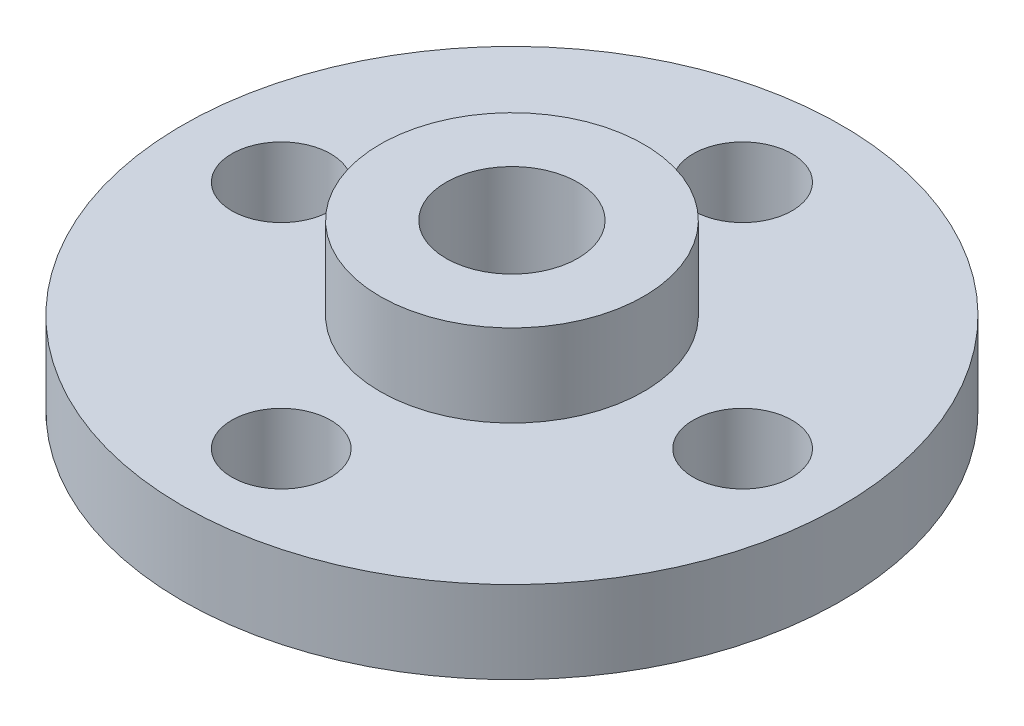
ISO-10303-21;
HEADER;
FILE_DESCRIPTION(('STEP AP214'),'2;1');
FILE_NAME('part.step','',(''),(''),'','','');
FILE_SCHEMA(('AUTOMOTIVE_DESIGN { 1 0 10303 214 1 1 1 1 }'));
ENDSEC;
DATA;
#1=APPLICATION_CONTEXT('core data for automotive mechanical design processes');
#2=APPLICATION_PROTOCOL_DEFINITION('international standard','automotive_design',2000,#1);
#3=PRODUCT_CONTEXT('',#1,'mechanical');
#4=PRODUCT('Part','Part','',(#3));
#5=PRODUCT_RELATED_PRODUCT_CATEGORY('part','',(#4));
#6=PRODUCT_DEFINITION_FORMATION('','',#4);
#7=PRODUCT_DEFINITION_CONTEXT('part definition',#1,'design');
#8=PRODUCT_DEFINITION('design','',#6,#7);
#9=PRODUCT_DEFINITION_SHAPE('','',#8);
#10=(LENGTH_UNIT() NAMED_UNIT(*) SI_UNIT(.MILLI.,.METRE.));
#11=(NAMED_UNIT(*) PLANE_ANGLE_UNIT() SI_UNIT($,.RADIAN.));
#12=(NAMED_UNIT(*) SI_UNIT($,.STERADIAN.) SOLID_ANGLE_UNIT());
#13=UNCERTAINTY_MEASURE_WITH_UNIT(LENGTH_MEASURE(1.E-05),#10,'distance_accuracy_value','');
#14=(GEOMETRIC_REPRESENTATION_CONTEXT(3) GLOBAL_UNCERTAINTY_ASSIGNED_CONTEXT((#13)) GLOBAL_UNIT_ASSIGNED_CONTEXT((#10,
#11,#12)) REPRESENTATION_CONTEXT('',''));
#15=CARTESIAN_POINT('',(0.,0.,0.));
#16=DIRECTION('',(0.,0.,1.));
#17=DIRECTION('',(1.,0.,0.));
#18=AXIS2_PLACEMENT_3D('',#15,#16,#17);
#19=CARTESIAN_POINT('',(0.,2.5,0.));
#20=DIRECTION('',(0.,1.,0.));
#21=DIRECTION('',(0.,0.,1.));
#22=AXIS2_PLACEMENT_3D('',#19,#20,#21);
#23=PLANE('',#22);
#24=CARTESIAN_POINT('',(0.,2.5,-7.));
#25=DIRECTION('',(0.,1.,0.));
#26=DIRECTION('',(0.,0.,1.));
#27=AXIS2_PLACEMENT_3D('',#24,#25,#26);
#28=CIRCLE('',#27,1.5);
#29=CARTESIAN_POINT('',(0.,2.5,-5.5));
#30=VERTEX_POINT('',#29);
#31=EDGE_CURVE('E79',#30,#30,#28,.T.);
#32=ORIENTED_EDGE('',*,*,#31,.F.);
#33=EDGE_LOOP('',(#32));
#34=FACE_BOUND('',#33,.T.);
#35=CARTESIAN_POINT('',(7.,2.5,0.));
#36=DIRECTION('',(0.,1.,0.));
#37=DIRECTION('',(0.,0.,1.));
#38=AXIS2_PLACEMENT_3D('',#35,#36,#37);
#39=CIRCLE('',#38,1.5);
#40=CARTESIAN_POINT('',(7.,2.5,1.5));
#41=VERTEX_POINT('',#40);
#42=EDGE_CURVE('E76',#41,#41,#39,.T.);
#43=ORIENTED_EDGE('',*,*,#42,.F.);
#44=EDGE_LOOP('',(#43));
#45=FACE_BOUND('',#44,.T.);
#46=CARTESIAN_POINT('',(0.,2.5,7.));
#47=DIRECTION('',(0.,1.,0.));
#48=DIRECTION('',(0.,0.,1.));
#49=AXIS2_PLACEMENT_3D('',#46,#47,#48);
#50=CIRCLE('',#49,1.5);
#51=CARTESIAN_POINT('',(0.,2.5,8.5));
#52=VERTEX_POINT('',#51);
#53=EDGE_CURVE('E70',#52,#52,#50,.T.);
#54=ORIENTED_EDGE('',*,*,#53,.F.);
#55=EDGE_LOOP('',(#54));
#56=FACE_BOUND('',#55,.T.);
#57=CARTESIAN_POINT('',(-7.,2.5,0.));
#58=DIRECTION('',(0.,1.,0.));
#59=DIRECTION('',(0.,0.,1.));
#60=AXIS2_PLACEMENT_3D('',#57,#58,#59);
#61=CIRCLE('',#60,1.5);
#62=CARTESIAN_POINT('',(-7.,2.5,1.5));
#63=VERTEX_POINT('',#62);
#64=EDGE_CURVE('E64',#63,#63,#61,.T.);
#65=ORIENTED_EDGE('',*,*,#64,.F.);
#66=EDGE_LOOP('',(#65));
#67=FACE_BOUND('',#66,.T.);
#68=CARTESIAN_POINT('',(0.,2.5,0.));
#69=DIRECTION('',(0.,1.,0.));
#70=DIRECTION('',(0.,0.,1.));
#71=AXIS2_PLACEMENT_3D('',#68,#69,#70);
#72=CIRCLE('',#71,10.);
#73=CARTESIAN_POINT('',(0.,2.5,10.));
#74=VERTEX_POINT('',#73);
#75=EDGE_CURVE('E10',#74,#74,#72,.T.);
#76=ORIENTED_EDGE('',*,*,#75,.T.);
#77=EDGE_LOOP('',(#76));
#78=FACE_BOUND('',#77,.T.);
#79=CARTESIAN_POINT('',(0.,2.5,0.));
#80=DIRECTION('',(0.,1.,0.));
#81=DIRECTION('',(0.,0.,1.));
#82=AXIS2_PLACEMENT_3D('',#79,#80,#81);
#83=CIRCLE('',#82,4.);
#84=CARTESIAN_POINT('',(0.,2.5,4.));
#85=VERTEX_POINT('',#84);
#86=EDGE_CURVE('E52',#85,#85,#83,.T.);
#87=ORIENTED_EDGE('',*,*,#86,.F.);
#88=EDGE_LOOP('',(#87));
#89=FACE_BOUND('',#88,.T.);
#90=ADVANCED_FACE('F36',(#34,#45,#56,#67,#78,#89),#23,.T.);
#91=CARTESIAN_POINT('',(0.,0.,0.));
#92=DIRECTION('',(0.,1.,0.));
#93=DIRECTION('',(0.,0.,1.));
#94=AXIS2_PLACEMENT_3D('',#91,#92,#93);
#95=PLANE('',#94);
#96=CARTESIAN_POINT('',(0.,0.,-7.));
#97=DIRECTION('',(0.,1.,0.));
#98=DIRECTION('',(0.,0.,1.));
#99=AXIS2_PLACEMENT_3D('',#96,#97,#98);
#100=CIRCLE('',#99,1.5);
#101=CARTESIAN_POINT('',(0.,0.,-5.5));
#102=VERTEX_POINT('',#101);
#103=EDGE_CURVE('E60',#102,#102,#100,.T.);
#104=ORIENTED_EDGE('',*,*,#103,.T.);
#105=EDGE_LOOP('',(#104));
#106=FACE_BOUND('',#105,.T.);
#107=CARTESIAN_POINT('',(7.,0.,0.));
#108=DIRECTION('',(0.,1.,0.));
#109=DIRECTION('',(0.,0.,1.));
#110=AXIS2_PLACEMENT_3D('',#107,#108,#109);
#111=CIRCLE('',#110,1.5);
#112=CARTESIAN_POINT('',(7.,0.,1.5));
#113=VERTEX_POINT('',#112);
#114=EDGE_CURVE('E73',#113,#113,#111,.T.);
#115=ORIENTED_EDGE('',*,*,#114,.T.);
#116=EDGE_LOOP('',(#115));
#117=FACE_BOUND('',#116,.T.);
#118=CARTESIAN_POINT('',(0.,0.,7.));
#119=DIRECTION('',(0.,1.,0.));
#120=DIRECTION('',(0.,0.,1.));
#121=AXIS2_PLACEMENT_3D('',#118,#119,#120);
#122=CIRCLE('',#121,1.5);
#123=CARTESIAN_POINT('',(0.,0.,8.5));
#124=VERTEX_POINT('',#123);
#125=EDGE_CURVE('E67',#124,#124,#122,.T.);
#126=ORIENTED_EDGE('',*,*,#125,.T.);
#127=EDGE_LOOP('',(#126));
#128=FACE_BOUND('',#127,.T.);
#129=CARTESIAN_POINT('',(-7.,0.,0.));
#130=DIRECTION('',(0.,1.,0.));
#131=DIRECTION('',(0.,0.,1.));
#132=AXIS2_PLACEMENT_3D('',#129,#130,#131);
#133=CIRCLE('',#132,1.5);
#134=CARTESIAN_POINT('',(-7.,0.,1.5));
#135=VERTEX_POINT('',#134);
#136=EDGE_CURVE('E61',#135,#135,#133,.T.);
#137=ORIENTED_EDGE('',*,*,#136,.T.);
#138=EDGE_LOOP('',(#137));
#139=FACE_BOUND('',#138,.T.);
#140=CARTESIAN_POINT('',(0.,0.,0.));
#141=DIRECTION('',(0.,1.,0.));
#142=DIRECTION('',(0.,0.,1.));
#143=AXIS2_PLACEMENT_3D('',#140,#141,#142);
#144=CIRCLE('',#143,10.);
#145=CARTESIAN_POINT('',(0.,0.,10.));
#146=VERTEX_POINT('',#145);
#147=EDGE_CURVE('E40',#146,#146,#144,.T.);
#148=ORIENTED_EDGE('',*,*,#147,.F.);
#149=EDGE_LOOP('',(#148));
#150=FACE_BOUND('',#149,.T.);
#151=CARTESIAN_POINT('',(0.,0.,0.));
#152=DIRECTION('',(0.,1.,0.));
#153=DIRECTION('',(0.,0.,1.));
#154=AXIS2_PLACEMENT_3D('',#151,#152,#153);
#155=CIRCLE('',#154,2.);
#156=CARTESIAN_POINT('',(0.,0.,2.));
#157=VERTEX_POINT('',#156);
#158=EDGE_CURVE('E47',#157,#157,#155,.T.);
#159=ORIENTED_EDGE('',*,*,#158,.T.);
#160=EDGE_LOOP('',(#159));
#161=FACE_BOUND('',#160,.T.);
#162=ADVANCED_FACE('F85',(#106,#117,#128,#139,#150,#161),#95,.F.);
#163=CARTESIAN_POINT('',(0.,2.5,0.));
#164=DIRECTION('',(0.,-1.,0.));
#165=DIRECTION('',(0.,0.,-1.));
#166=AXIS2_PLACEMENT_3D('',#163,#164,#165);
#167=CYLINDRICAL_SURFACE('',#166,10.);
#168=ORIENTED_EDGE('',*,*,#75,.F.);
#169=EDGE_LOOP('',(#168));
#170=FACE_BOUND('',#169,.T.);
#171=ORIENTED_EDGE('',*,*,#147,.T.);
#172=EDGE_LOOP('',(#171));
#173=FACE_BOUND('',#172,.T.);
#174=ADVANCED_FACE('F38',(#170,#173),#167,.T.);
#175=CARTESIAN_POINT('',(0.,2.5,0.));
#176=DIRECTION('',(0.,-1.,0.));
#177=DIRECTION('',(0.,0.,-1.));
#178=AXIS2_PLACEMENT_3D('',#175,#176,#177);
#179=CYLINDRICAL_SURFACE('',#178,2.);
#180=ORIENTED_EDGE('',*,*,#158,.F.);
#181=EDGE_LOOP('',(#180));
#182=FACE_BOUND('',#181,.T.);
#183=CARTESIAN_POINT('',(0.,5.,0.));
#184=DIRECTION('',(0.,1.,0.));
#185=DIRECTION('',(0.,0.,1.));
#186=AXIS2_PLACEMENT_3D('',#183,#184,#185);
#187=CIRCLE('',#186,2.);
#188=CARTESIAN_POINT('',(0.,5.,2.));
#189=VERTEX_POINT('',#188);
#190=EDGE_CURVE('E55',#189,#189,#187,.T.);
#191=ORIENTED_EDGE('',*,*,#190,.T.);
#192=EDGE_LOOP('',(#191));
#193=FACE_BOUND('',#192,.T.);
#194=ADVANCED_FACE('F119',(#182,#193),#179,.F.);
#195=CARTESIAN_POINT('',(0.,5.,0.));
#196=DIRECTION('',(0.,1.,0.));
#197=DIRECTION('',(0.,0.,1.));
#198=AXIS2_PLACEMENT_3D('',#195,#196,#197);
#199=PLANE('',#198);
#200=CARTESIAN_POINT('',(0.,5.,0.));
#201=DIRECTION('',(0.,1.,0.));
#202=DIRECTION('',(0.,0.,1.));
#203=AXIS2_PLACEMENT_3D('',#200,#201,#202);
#204=CIRCLE('',#203,4.);
#205=CARTESIAN_POINT('',(0.,5.,4.));
#206=VERTEX_POINT('',#205);
#207=EDGE_CURVE('E51',#206,#206,#204,.T.);
#208=ORIENTED_EDGE('',*,*,#207,.T.);
#209=EDGE_LOOP('',(#208));
#210=FACE_BOUND('',#209,.T.);
#211=ORIENTED_EDGE('',*,*,#190,.F.);
#212=EDGE_LOOP('',(#211));
#213=FACE_BOUND('',#212,.T.);
#214=ADVANCED_FACE('F109',(#210,#213),#199,.T.);
#215=CARTESIAN_POINT('',(0.,5.,0.));
#216=DIRECTION('',(0.,-1.,0.));
#217=DIRECTION('',(0.,0.,-1.));
#218=AXIS2_PLACEMENT_3D('',#215,#216,#217);
#219=CYLINDRICAL_SURFACE('',#218,4.);
#220=ORIENTED_EDGE('',*,*,#207,.F.);
#221=EDGE_LOOP('',(#220));
#222=FACE_BOUND('',#221,.T.);
#223=ORIENTED_EDGE('',*,*,#86,.T.);
#224=EDGE_LOOP('',(#223));
#225=FACE_BOUND('',#224,.T.);
#226=ADVANCED_FACE('F106',(#222,#225),#219,.T.);
#227=CARTESIAN_POINT('',(-7.,0.,0.));
#228=DIRECTION('',(0.,1.,0.));
#229=DIRECTION('',(0.,0.,1.));
#230=AXIS2_PLACEMENT_3D('',#227,#228,#229);
#231=CYLINDRICAL_SURFACE('',#230,1.5);
#232=ORIENTED_EDGE('',*,*,#136,.F.);
#233=EDGE_LOOP('',(#232));
#234=FACE_BOUND('',#233,.T.);
#235=ORIENTED_EDGE('',*,*,#64,.T.);
#236=EDGE_LOOP('',(#235));
#237=FACE_BOUND('',#236,.T.);
#238=ADVANCED_FACE('F108',(#234,#237),#231,.F.);
#239=CARTESIAN_POINT('',(0.,0.,7.));
#240=DIRECTION('',(0.,1.,0.));
#241=DIRECTION('',(0.,0.,1.));
#242=AXIS2_PLACEMENT_3D('',#239,#240,#241);
#243=CYLINDRICAL_SURFACE('',#242,1.5);
#244=ORIENTED_EDGE('',*,*,#125,.F.);
#245=EDGE_LOOP('',(#244));
#246=FACE_BOUND('',#245,.T.);
#247=ORIENTED_EDGE('',*,*,#53,.T.);
#248=EDGE_LOOP('',(#247));
#249=FACE_BOUND('',#248,.T.);
#250=ADVANCED_FACE('F116',(#246,#249),#243,.F.);
#251=CARTESIAN_POINT('',(7.,0.,0.));
#252=DIRECTION('',(0.,1.,0.));
#253=DIRECTION('',(0.,0.,1.));
#254=AXIS2_PLACEMENT_3D('',#251,#252,#253);
#255=CYLINDRICAL_SURFACE('',#254,1.5);
#256=ORIENTED_EDGE('',*,*,#114,.F.);
#257=EDGE_LOOP('',(#256));
#258=FACE_BOUND('',#257,.T.);
#259=ORIENTED_EDGE('',*,*,#42,.T.);
#260=EDGE_LOOP('',(#259));
#261=FACE_BOUND('',#260,.T.);
#262=ADVANCED_FACE('F91',(#258,#261),#255,.F.);
#263=CARTESIAN_POINT('',(0.,0.,-7.));
#264=DIRECTION('',(0.,1.,0.));
#265=DIRECTION('',(0.,0.,1.));
#266=AXIS2_PLACEMENT_3D('',#263,#264,#265);
#267=CYLINDRICAL_SURFACE('',#266,1.5);
#268=ORIENTED_EDGE('',*,*,#103,.F.);
#269=EDGE_LOOP('',(#268));
#270=FACE_BOUND('',#269,.T.);
#271=ORIENTED_EDGE('',*,*,#31,.T.);
#272=EDGE_LOOP('',(#271));
#273=FACE_BOUND('',#272,.T.);
#274=ADVANCED_FACE('F88',(#270,#273),#267,.F.);
#275=CLOSED_SHELL('',(#90,#162,#174,#194,#214,#226,#238,#250,#262,#274));
#276=MANIFOLD_SOLID_BREP('B2',#275);
#277=ADVANCED_BREP_SHAPE_REPRESENTATION('',(#18,#276),#14);
#278=SHAPE_DEFINITION_REPRESENTATION(#9,#277);
ENDSEC;
END-ISO-10303-21;
